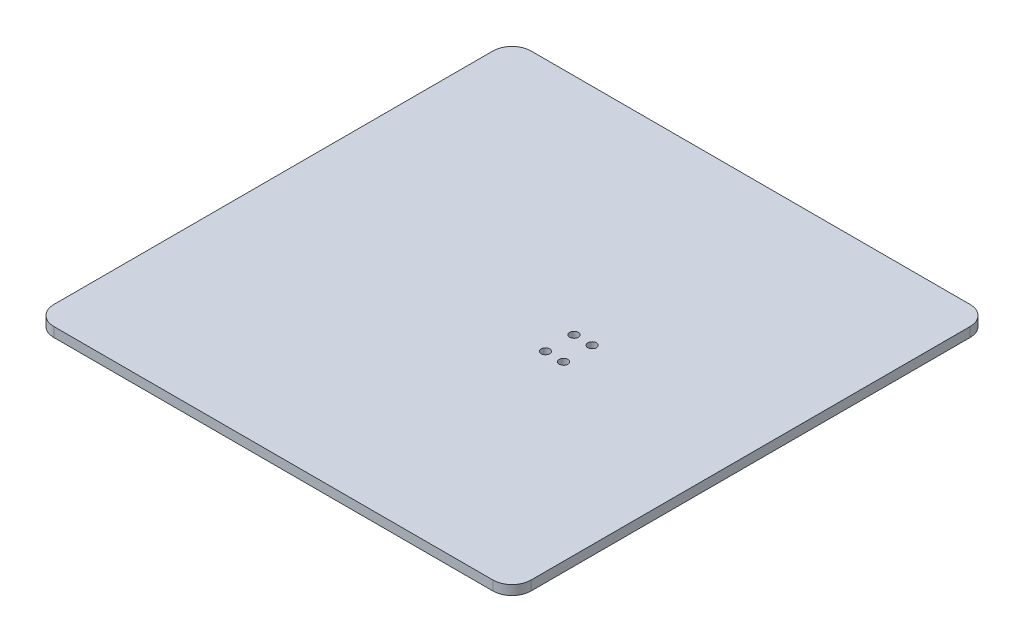
ISO-10303-21;
HEADER;
FILE_DESCRIPTION(('STEP AP214'),'2;1');
FILE_NAME('part.step','',(''),(''),'','','');
FILE_SCHEMA(('AUTOMOTIVE_DESIGN { 1 0 10303 214 1 1 1 1 }'));
ENDSEC;
DATA;
#1=APPLICATION_CONTEXT('core data for automotive mechanical design processes');
#2=APPLICATION_PROTOCOL_DEFINITION('international standard','automotive_design',2000,#1);
#3=PRODUCT_CONTEXT('',#1,'mechanical');
#4=PRODUCT('Part','Part','',(#3));
#5=PRODUCT_RELATED_PRODUCT_CATEGORY('part','',(#4));
#6=PRODUCT_DEFINITION_FORMATION('','',#4);
#7=PRODUCT_DEFINITION_CONTEXT('part definition',#1,'design');
#8=PRODUCT_DEFINITION('design','',#6,#7);
#9=PRODUCT_DEFINITION_SHAPE('','',#8);
#10=(LENGTH_UNIT() NAMED_UNIT(*) SI_UNIT(.MILLI.,.METRE.));
#11=(NAMED_UNIT(*) PLANE_ANGLE_UNIT() SI_UNIT($,.RADIAN.));
#12=(NAMED_UNIT(*) SI_UNIT($,.STERADIAN.) SOLID_ANGLE_UNIT());
#13=UNCERTAINTY_MEASURE_WITH_UNIT(LENGTH_MEASURE(1.E-05),#10,'distance_accuracy_value','');
#14=(GEOMETRIC_REPRESENTATION_CONTEXT(3) GLOBAL_UNCERTAINTY_ASSIGNED_CONTEXT((#13)) GLOBAL_UNIT_ASSIGNED_CONTEXT((#10,
#11,#12)) REPRESENTATION_CONTEXT('',''));
#15=CARTESIAN_POINT('',(0.,0.,0.));
#16=DIRECTION('',(0.,0.,1.));
#17=DIRECTION('',(1.,0.,0.));
#18=AXIS2_PLACEMENT_3D('',#15,#16,#17);
#19=CARTESIAN_POINT('',(230.,10.,230.));
#20=DIRECTION('',(0.,-1.,0.));
#21=DIRECTION('',(0.,0.,-1.));
#22=AXIS2_PLACEMENT_3D('',#19,#20,#21);
#23=CYLINDRICAL_SURFACE('',#22,20.);
#24=CARTESIAN_POINT('',(230.,0.,230.));
#25=DIRECTION('',(0.,1.,0.));
#26=DIRECTION('',(0.,0.,-1.));
#27=AXIS2_PLACEMENT_3D('',#24,#25,#26);
#28=CIRCLE('',#27,20.);
#29=CARTESIAN_POINT('',(230.,0.,250.));
#30=VERTEX_POINT('',#29);
#31=CARTESIAN_POINT('',(250.,0.,230.));
#32=VERTEX_POINT('',#31);
#33=EDGE_CURVE('E137',#30,#32,#28,.T.);
#34=ORIENTED_EDGE('',*,*,#33,.T.);
#35=DIRECTION('',(0.,-1.,0.));
#36=VECTOR('',#35,1.);
#37=CARTESIAN_POINT('',(250.,10.,230.));
#38=LINE('',#37,#36);
#39=CARTESIAN_POINT('',(250.,10.,230.));
#40=VERTEX_POINT('',#39);
#41=EDGE_CURVE('E11',#40,#32,#38,.T.);
#42=ORIENTED_EDGE('',*,*,#41,.F.);
#43=CARTESIAN_POINT('',(230.,10.,230.));
#44=DIRECTION('',(0.,1.,0.));
#45=DIRECTION('',(0.,0.,-1.));
#46=AXIS2_PLACEMENT_3D('',#43,#44,#45);
#47=CIRCLE('',#46,20.);
#48=CARTESIAN_POINT('',(230.,10.,250.));
#49=VERTEX_POINT('',#48);
#50=EDGE_CURVE('E152',#49,#40,#47,.T.);
#51=ORIENTED_EDGE('',*,*,#50,.F.);
#52=DIRECTION('',(0.,-1.,0.));
#53=VECTOR('',#52,1.);
#54=CARTESIAN_POINT('',(230.,10.,250.));
#55=LINE('',#54,#53);
#56=EDGE_CURVE('E133',#49,#30,#55,.T.);
#57=ORIENTED_EDGE('',*,*,#56,.T.);
#58=EDGE_LOOP('',(#34,#42,#51,#57));
#59=FACE_BOUND('',#58,.T.);
#60=ADVANCED_FACE('F41',(#59),#23,.T.);
#61=CARTESIAN_POINT('',(250.,10.,-230.));
#62=DIRECTION('',(-1.,0.,0.));
#63=DIRECTION('',(0.,0.,1.));
#64=AXIS2_PLACEMENT_3D('',#61,#62,#63);
#65=PLANE('',#64);
#66=DIRECTION('',(0.,0.,-1.));
#67=VECTOR('',#66,1.);
#68=CARTESIAN_POINT('',(250.,0.,-230.));
#69=LINE('',#68,#67);
#70=CARTESIAN_POINT('',(250.,0.,-230.));
#71=VERTEX_POINT('',#70);
#72=EDGE_CURVE('E140',#32,#71,#69,.T.);
#73=ORIENTED_EDGE('',*,*,#72,.T.);
#74=DIRECTION('',(0.,-1.,0.));
#75=VECTOR('',#74,1.);
#76=CARTESIAN_POINT('',(250.,10.,-230.));
#77=LINE('',#76,#75);
#78=CARTESIAN_POINT('',(250.,10.,-230.));
#79=VERTEX_POINT('',#78);
#80=EDGE_CURVE('E49',#79,#71,#77,.T.);
#81=ORIENTED_EDGE('',*,*,#80,.F.);
#82=DIRECTION('',(0.,0.,-1.));
#83=VECTOR('',#82,1.);
#84=CARTESIAN_POINT('',(250.,10.,-230.));
#85=LINE('',#84,#83);
#86=EDGE_CURVE('E100',#40,#79,#85,.T.);
#87=ORIENTED_EDGE('',*,*,#86,.F.);
#88=ORIENTED_EDGE('',*,*,#41,.T.);
#89=EDGE_LOOP('',(#73,#81,#87,#88));
#90=FACE_BOUND('',#89,.T.);
#91=ADVANCED_FACE('F237',(#90),#65,.F.);
#92=CARTESIAN_POINT('',(230.,10.,-230.));
#93=DIRECTION('',(0.,-1.,0.));
#94=DIRECTION('',(0.,0.,-1.));
#95=AXIS2_PLACEMENT_3D('',#92,#93,#94);
#96=CYLINDRICAL_SURFACE('',#95,20.);
#97=CARTESIAN_POINT('',(230.,0.,-230.));
#98=DIRECTION('',(0.,1.,0.));
#99=DIRECTION('',(0.,0.,1.));
#100=AXIS2_PLACEMENT_3D('',#97,#98,#99);
#101=CIRCLE('',#100,20.);
#102=CARTESIAN_POINT('',(230.,0.,-250.));
#103=VERTEX_POINT('',#102);
#104=EDGE_CURVE('E143',#71,#103,#101,.T.);
#105=ORIENTED_EDGE('',*,*,#104,.T.);
#106=DIRECTION('',(0.,-1.,0.));
#107=VECTOR('',#106,1.);
#108=CARTESIAN_POINT('',(230.,10.,-250.));
#109=LINE('',#108,#107);
#110=CARTESIAN_POINT('',(230.,10.,-250.));
#111=VERTEX_POINT('',#110);
#112=EDGE_CURVE('E159',#111,#103,#109,.T.);
#113=ORIENTED_EDGE('',*,*,#112,.F.);
#114=CARTESIAN_POINT('',(230.,10.,-230.));
#115=DIRECTION('',(0.,1.,0.));
#116=DIRECTION('',(0.,0.,1.));
#117=AXIS2_PLACEMENT_3D('',#114,#115,#116);
#118=CIRCLE('',#117,20.);
#119=EDGE_CURVE('E167',#79,#111,#118,.T.);
#120=ORIENTED_EDGE('',*,*,#119,.F.);
#121=ORIENTED_EDGE('',*,*,#80,.T.);
#122=EDGE_LOOP('',(#105,#113,#120,#121));
#123=FACE_BOUND('',#122,.T.);
#124=ADVANCED_FACE('F165',(#123),#96,.T.);
#125=CARTESIAN_POINT('',(-230.,10.,-250.));
#126=DIRECTION('',(0.,0.,1.));
#127=DIRECTION('',(1.,0.,0.));
#128=AXIS2_PLACEMENT_3D('',#125,#126,#127);
#129=PLANE('',#128);
#130=DIRECTION('',(-1.,0.,0.));
#131=VECTOR('',#130,1.);
#132=CARTESIAN_POINT('',(-230.,0.,-250.));
#133=LINE('',#132,#131);
#134=CARTESIAN_POINT('',(-230.,0.,-250.));
#135=VERTEX_POINT('',#134);
#136=EDGE_CURVE('E145',#103,#135,#133,.T.);
#137=ORIENTED_EDGE('',*,*,#136,.T.);
#138=DIRECTION('',(0.,-1.,0.));
#139=VECTOR('',#138,1.);
#140=CARTESIAN_POINT('',(-230.,10.,-250.));
#141=LINE('',#140,#139);
#142=CARTESIAN_POINT('',(-230.,10.,-250.));
#143=VERTEX_POINT('',#142);
#144=EDGE_CURVE('E156',#143,#135,#141,.T.);
#145=ORIENTED_EDGE('',*,*,#144,.F.);
#146=DIRECTION('',(-1.,0.,0.));
#147=VECTOR('',#146,1.);
#148=CARTESIAN_POINT('',(-230.,10.,-250.));
#149=LINE('',#148,#147);
#150=EDGE_CURVE('E179',#111,#143,#149,.T.);
#151=ORIENTED_EDGE('',*,*,#150,.F.);
#152=ORIENTED_EDGE('',*,*,#112,.T.);
#153=EDGE_LOOP('',(#137,#145,#151,#152));
#154=FACE_BOUND('',#153,.T.);
#155=ADVANCED_FACE('F175',(#154),#129,.F.);
#156=CARTESIAN_POINT('',(-230.,10.,-230.));
#157=DIRECTION('',(0.,-1.,0.));
#158=DIRECTION('',(0.,0.,-1.));
#159=AXIS2_PLACEMENT_3D('',#156,#157,#158);
#160=CYLINDRICAL_SURFACE('',#159,20.);
#161=CARTESIAN_POINT('',(-230.,0.,-230.));
#162=DIRECTION('',(0.,1.,0.));
#163=DIRECTION('',(0.,0.,1.));
#164=AXIS2_PLACEMENT_3D('',#161,#162,#163);
#165=CIRCLE('',#164,20.);
#166=CARTESIAN_POINT('',(-250.,0.,-230.));
#167=VERTEX_POINT('',#166);
#168=EDGE_CURVE('E147',#135,#167,#165,.T.);
#169=ORIENTED_EDGE('',*,*,#168,.T.);
#170=DIRECTION('',(0.,-1.,0.));
#171=VECTOR('',#170,1.);
#172=CARTESIAN_POINT('',(-250.,10.,-230.));
#173=LINE('',#172,#171);
#174=CARTESIAN_POINT('',(-250.,10.,-230.));
#175=VERTEX_POINT('',#174);
#176=EDGE_CURVE('E128',#175,#167,#173,.T.);
#177=ORIENTED_EDGE('',*,*,#176,.F.);
#178=CARTESIAN_POINT('',(-230.,10.,-230.));
#179=DIRECTION('',(0.,1.,0.));
#180=DIRECTION('',(0.,0.,1.));
#181=AXIS2_PLACEMENT_3D('',#178,#179,#180);
#182=CIRCLE('',#181,20.);
#183=EDGE_CURVE('E119',#143,#175,#182,.T.);
#184=ORIENTED_EDGE('',*,*,#183,.F.);
#185=ORIENTED_EDGE('',*,*,#144,.T.);
#186=EDGE_LOOP('',(#169,#177,#184,#185));
#187=FACE_BOUND('',#186,.T.);
#188=ADVANCED_FACE('F178',(#187),#160,.T.);
#189=CARTESIAN_POINT('',(-250.,10.,-230.));
#190=DIRECTION('',(1.,0.,0.));
#191=DIRECTION('',(0.,0.,-1.));
#192=AXIS2_PLACEMENT_3D('',#189,#190,#191);
#193=PLANE('',#192);
#194=DIRECTION('',(0.,0.,1.));
#195=VECTOR('',#194,1.);
#196=CARTESIAN_POINT('',(-250.,0.,-230.));
#197=LINE('',#196,#195);
#198=CARTESIAN_POINT('',(-250.,0.,230.));
#199=VERTEX_POINT('',#198);
#200=EDGE_CURVE('E127',#167,#199,#197,.T.);
#201=ORIENTED_EDGE('',*,*,#200,.T.);
#202=DIRECTION('',(0.,-1.,0.));
#203=VECTOR('',#202,1.);
#204=CARTESIAN_POINT('',(-250.,10.,230.));
#205=LINE('',#204,#203);
#206=CARTESIAN_POINT('',(-250.,10.,230.));
#207=VERTEX_POINT('',#206);
#208=EDGE_CURVE('E124',#207,#199,#205,.T.);
#209=ORIENTED_EDGE('',*,*,#208,.F.);
#210=DIRECTION('',(0.,0.,1.));
#211=VECTOR('',#210,1.);
#212=CARTESIAN_POINT('',(-250.,10.,-230.));
#213=LINE('',#212,#211);
#214=EDGE_CURVE('E113',#175,#207,#213,.T.);
#215=ORIENTED_EDGE('',*,*,#214,.F.);
#216=ORIENTED_EDGE('',*,*,#176,.T.);
#217=EDGE_LOOP('',(#201,#209,#215,#216));
#218=FACE_BOUND('',#217,.T.);
#219=ADVANCED_FACE('F125',(#218),#193,.F.);
#220=CARTESIAN_POINT('',(-230.,10.,230.));
#221=DIRECTION('',(0.,-1.,0.));
#222=DIRECTION('',(0.,0.,-1.));
#223=AXIS2_PLACEMENT_3D('',#220,#221,#222);
#224=CYLINDRICAL_SURFACE('',#223,20.);
#225=CARTESIAN_POINT('',(-230.,0.,230.));
#226=DIRECTION('',(0.,1.,0.));
#227=DIRECTION('',(0.,0.,-1.));
#228=AXIS2_PLACEMENT_3D('',#225,#226,#227);
#229=CIRCLE('',#228,20.);
#230=CARTESIAN_POINT('',(-230.,0.,250.));
#231=VERTEX_POINT('',#230);
#232=EDGE_CURVE('E86',#199,#231,#229,.T.);
#233=ORIENTED_EDGE('',*,*,#232,.T.);
#234=DIRECTION('',(0.,-1.,0.));
#235=VECTOR('',#234,1.);
#236=CARTESIAN_POINT('',(-230.,10.,250.));
#237=LINE('',#236,#235);
#238=CARTESIAN_POINT('',(-230.,10.,250.));
#239=VERTEX_POINT('',#238);
#240=EDGE_CURVE('E129',#239,#231,#237,.T.);
#241=ORIENTED_EDGE('',*,*,#240,.F.);
#242=CARTESIAN_POINT('',(-230.,10.,230.));
#243=DIRECTION('',(0.,1.,0.));
#244=DIRECTION('',(0.,0.,-1.));
#245=AXIS2_PLACEMENT_3D('',#242,#243,#244);
#246=CIRCLE('',#245,20.);
#247=EDGE_CURVE('E117',#207,#239,#246,.T.);
#248=ORIENTED_EDGE('',*,*,#247,.F.);
#249=ORIENTED_EDGE('',*,*,#208,.T.);
#250=EDGE_LOOP('',(#233,#241,#248,#249));
#251=FACE_BOUND('',#250,.T.);
#252=ADVANCED_FACE('F131',(#251),#224,.T.);
#253=CARTESIAN_POINT('',(-230.,10.,250.));
#254=DIRECTION('',(0.,0.,-1.));
#255=DIRECTION('',(-1.,0.,0.));
#256=AXIS2_PLACEMENT_3D('',#253,#254,#255);
#257=PLANE('',#256);
#258=DIRECTION('',(1.,0.,0.));
#259=VECTOR('',#258,1.);
#260=CARTESIAN_POINT('',(-230.,0.,250.));
#261=LINE('',#260,#259);
#262=EDGE_CURVE('E92',#231,#30,#261,.T.);
#263=ORIENTED_EDGE('',*,*,#262,.T.);
#264=ORIENTED_EDGE('',*,*,#56,.F.);
#265=DIRECTION('',(1.,0.,0.));
#266=VECTOR('',#265,1.);
#267=CARTESIAN_POINT('',(-230.,10.,250.));
#268=LINE('',#267,#266);
#269=EDGE_CURVE('E57',#239,#49,#268,.T.);
#270=ORIENTED_EDGE('',*,*,#269,.F.);
#271=ORIENTED_EDGE('',*,*,#240,.T.);
#272=EDGE_LOOP('',(#263,#264,#270,#271));
#273=FACE_BOUND('',#272,.T.);
#274=ADVANCED_FACE('F221',(#273),#257,.F.);
#275=CARTESIAN_POINT('',(230.,10.,230.));
#276=DIRECTION('',(0.,-1.,0.));
#277=DIRECTION('',(0.,0.,-1.));
#278=AXIS2_PLACEMENT_3D('',#275,#276,#277);
#279=PLANE('',#278);
#280=CARTESIAN_POINT('',(68.9999999999996,10.,-15.0000000000001));
#281=DIRECTION('',(0.,1.,0.));
#282=DIRECTION('',(0.,0.,1.));
#283=AXIS2_PLACEMENT_3D('',#280,#281,#282);
#284=CIRCLE('',#283,4.5);
#285=CARTESIAN_POINT('',(68.9999999999996,10.,-10.5000000000001));
#286=VERTEX_POINT('',#285);
#287=EDGE_CURVE('E191',#286,#286,#284,.T.);
#288=ORIENTED_EDGE('',*,*,#287,.F.);
#289=EDGE_LOOP('',(#288));
#290=FACE_BOUND('',#289,.T.);
#291=CARTESIAN_POINT('',(49.9999999999996,10.,-15.0000000000001));
#292=DIRECTION('',(0.,1.,0.));
#293=DIRECTION('',(0.,0.,1.));
#294=AXIS2_PLACEMENT_3D('',#291,#292,#293);
#295=CIRCLE('',#294,4.5);
#296=CARTESIAN_POINT('',(49.9999999999996,10.,-10.5000000000001));
#297=VERTEX_POINT('',#296);
#298=EDGE_CURVE('E197',#297,#297,#295,.T.);
#299=ORIENTED_EDGE('',*,*,#298,.F.);
#300=EDGE_LOOP('',(#299));
#301=FACE_BOUND('',#300,.T.);
#302=CARTESIAN_POINT('',(49.9999999999996,10.,14.9999999999999));
#303=DIRECTION('',(0.,1.,0.));
#304=DIRECTION('',(0.,0.,1.));
#305=AXIS2_PLACEMENT_3D('',#302,#303,#304);
#306=CIRCLE('',#305,4.5);
#307=CARTESIAN_POINT('',(49.9999999999996,10.,19.4999999999999));
#308=VERTEX_POINT('',#307);
#309=EDGE_CURVE('E203',#308,#308,#306,.T.);
#310=ORIENTED_EDGE('',*,*,#309,.F.);
#311=EDGE_LOOP('',(#310));
#312=FACE_BOUND('',#311,.T.);
#313=CARTESIAN_POINT('',(68.9999999999996,10.,14.9999999999999));
#314=DIRECTION('',(0.,1.,0.));
#315=DIRECTION('',(0.,0.,1.));
#316=AXIS2_PLACEMENT_3D('',#313,#314,#315);
#317=CIRCLE('',#316,4.5);
#318=CARTESIAN_POINT('',(68.9999999999996,10.,19.4999999999999));
#319=VERTEX_POINT('',#318);
#320=EDGE_CURVE('E185',#319,#319,#317,.T.);
#321=ORIENTED_EDGE('',*,*,#320,.F.);
#322=EDGE_LOOP('',(#321));
#323=FACE_BOUND('',#322,.T.);
#324=ORIENTED_EDGE('',*,*,#50,.T.);
#325=ORIENTED_EDGE('',*,*,#86,.T.);
#326=ORIENTED_EDGE('',*,*,#119,.T.);
#327=ORIENTED_EDGE('',*,*,#150,.T.);
#328=ORIENTED_EDGE('',*,*,#183,.T.);
#329=ORIENTED_EDGE('',*,*,#214,.T.);
#330=ORIENTED_EDGE('',*,*,#247,.T.);
#331=ORIENTED_EDGE('',*,*,#269,.T.);
#332=EDGE_LOOP('',(#324,#325,#326,#327,#328,#329,#330,#331));
#333=FACE_BOUND('',#332,.T.);
#334=ADVANCED_FACE('F115',(#290,#301,#312,#323,#333),#279,.F.);
#335=CARTESIAN_POINT('',(230.,0.,230.));
#336=DIRECTION('',(0.,-1.,0.));
#337=DIRECTION('',(0.,0.,-1.));
#338=AXIS2_PLACEMENT_3D('',#335,#336,#337);
#339=PLANE('',#338);
#340=CARTESIAN_POINT('',(68.9999999999996,0.,-15.0000000000001));
#341=DIRECTION('',(0.,1.,0.));
#342=DIRECTION('',(0.,0.,1.));
#343=AXIS2_PLACEMENT_3D('',#340,#341,#342);
#344=CIRCLE('',#343,4.5);
#345=CARTESIAN_POINT('',(68.9999999999996,0.,-10.5000000000001));
#346=VERTEX_POINT('',#345);
#347=EDGE_CURVE('E194',#346,#346,#344,.T.);
#348=ORIENTED_EDGE('',*,*,#347,.T.);
#349=EDGE_LOOP('',(#348));
#350=FACE_BOUND('',#349,.T.);
#351=CARTESIAN_POINT('',(49.9999999999996,0.,-15.0000000000001));
#352=DIRECTION('',(0.,1.,0.));
#353=DIRECTION('',(0.,0.,1.));
#354=AXIS2_PLACEMENT_3D('',#351,#352,#353);
#355=CIRCLE('',#354,4.5);
#356=CARTESIAN_POINT('',(49.9999999999996,0.,-10.5000000000001));
#357=VERTEX_POINT('',#356);
#358=EDGE_CURVE('E200',#357,#357,#355,.T.);
#359=ORIENTED_EDGE('',*,*,#358,.T.);
#360=EDGE_LOOP('',(#359));
#361=FACE_BOUND('',#360,.T.);
#362=CARTESIAN_POINT('',(49.9999999999996,0.,14.9999999999999));
#363=DIRECTION('',(0.,1.,0.));
#364=DIRECTION('',(0.,0.,1.));
#365=AXIS2_PLACEMENT_3D('',#362,#363,#364);
#366=CIRCLE('',#365,4.5);
#367=CARTESIAN_POINT('',(49.9999999999996,0.,19.4999999999999));
#368=VERTEX_POINT('',#367);
#369=EDGE_CURVE('E188',#368,#368,#366,.T.);
#370=ORIENTED_EDGE('',*,*,#369,.T.);
#371=EDGE_LOOP('',(#370));
#372=FACE_BOUND('',#371,.T.);
#373=CARTESIAN_POINT('',(68.9999999999996,0.,14.9999999999999));
#374=DIRECTION('',(0.,1.,0.));
#375=DIRECTION('',(0.,0.,1.));
#376=AXIS2_PLACEMENT_3D('',#373,#374,#375);
#377=CIRCLE('',#376,4.5);
#378=CARTESIAN_POINT('',(68.9999999999996,0.,19.4999999999999));
#379=VERTEX_POINT('',#378);
#380=EDGE_CURVE('E141',#379,#379,#377,.T.);
#381=ORIENTED_EDGE('',*,*,#380,.T.);
#382=EDGE_LOOP('',(#381));
#383=FACE_BOUND('',#382,.T.);
#384=ORIENTED_EDGE('',*,*,#33,.F.);
#385=ORIENTED_EDGE('',*,*,#262,.F.);
#386=ORIENTED_EDGE('',*,*,#232,.F.);
#387=ORIENTED_EDGE('',*,*,#200,.F.);
#388=ORIENTED_EDGE('',*,*,#168,.F.);
#389=ORIENTED_EDGE('',*,*,#136,.F.);
#390=ORIENTED_EDGE('',*,*,#104,.F.);
#391=ORIENTED_EDGE('',*,*,#72,.F.);
#392=EDGE_LOOP('',(#384,#385,#386,#387,#388,#389,#390,#391));
#393=FACE_BOUND('',#392,.T.);
#394=ADVANCED_FACE('F171',(#350,#361,#372,#383,#393),#339,.T.);
#395=CARTESIAN_POINT('',(68.9999999999996,0.,14.9999999999999));
#396=DIRECTION('',(0.,1.,0.));
#397=DIRECTION('',(0.,0.,1.));
#398=AXIS2_PLACEMENT_3D('',#395,#396,#397);
#399=CYLINDRICAL_SURFACE('',#398,4.5);
#400=ORIENTED_EDGE('',*,*,#380,.F.);
#401=EDGE_LOOP('',(#400));
#402=FACE_BOUND('',#401,.T.);
#403=ORIENTED_EDGE('',*,*,#320,.T.);
#404=EDGE_LOOP('',(#403));
#405=FACE_BOUND('',#404,.T.);
#406=ADVANCED_FACE('F215',(#402,#405),#399,.F.);
#407=CARTESIAN_POINT('',(49.9999999999996,0.,14.9999999999999));
#408=DIRECTION('',(0.,1.,0.));
#409=DIRECTION('',(0.,0.,1.));
#410=AXIS2_PLACEMENT_3D('',#407,#408,#409);
#411=CYLINDRICAL_SURFACE('',#410,4.5);
#412=ORIENTED_EDGE('',*,*,#369,.F.);
#413=EDGE_LOOP('',(#412));
#414=FACE_BOUND('',#413,.T.);
#415=ORIENTED_EDGE('',*,*,#309,.T.);
#416=EDGE_LOOP('',(#415));
#417=FACE_BOUND('',#416,.T.);
#418=ADVANCED_FACE('F211',(#414,#417),#411,.F.);
#419=CARTESIAN_POINT('',(49.9999999999996,0.,-15.0000000000001));
#420=DIRECTION('',(0.,1.,0.));
#421=DIRECTION('',(0.,0.,1.));
#422=AXIS2_PLACEMENT_3D('',#419,#420,#421);
#423=CYLINDRICAL_SURFACE('',#422,4.5);
#424=ORIENTED_EDGE('',*,*,#358,.F.);
#425=EDGE_LOOP('',(#424));
#426=FACE_BOUND('',#425,.T.);
#427=ORIENTED_EDGE('',*,*,#298,.T.);
#428=EDGE_LOOP('',(#427));
#429=FACE_BOUND('',#428,.T.);
#430=ADVANCED_FACE('F214',(#426,#429),#423,.F.);
#431=CARTESIAN_POINT('',(68.9999999999996,0.,-15.0000000000001));
#432=DIRECTION('',(0.,1.,0.));
#433=DIRECTION('',(0.,0.,1.));
#434=AXIS2_PLACEMENT_3D('',#431,#432,#433);
#435=CYLINDRICAL_SURFACE('',#434,4.5);
#436=ORIENTED_EDGE('',*,*,#347,.F.);
#437=EDGE_LOOP('',(#436));
#438=FACE_BOUND('',#437,.T.);
#439=ORIENTED_EDGE('',*,*,#287,.T.);
#440=EDGE_LOOP('',(#439));
#441=FACE_BOUND('',#440,.T.);
#442=ADVANCED_FACE('F324',(#438,#441),#435,.F.);
#443=CLOSED_SHELL('',(#60,#91,#124,#155,#188,#219,#252,#274,#334,#394,#406,#418,#430,#442));
#444=MANIFOLD_SOLID_BREP('B2',#443);
#445=ADVANCED_BREP_SHAPE_REPRESENTATION('',(#18,#444),#14);
#446=SHAPE_DEFINITION_REPRESENTATION(#9,#445);
ENDSEC;
END-ISO-10303-21;
